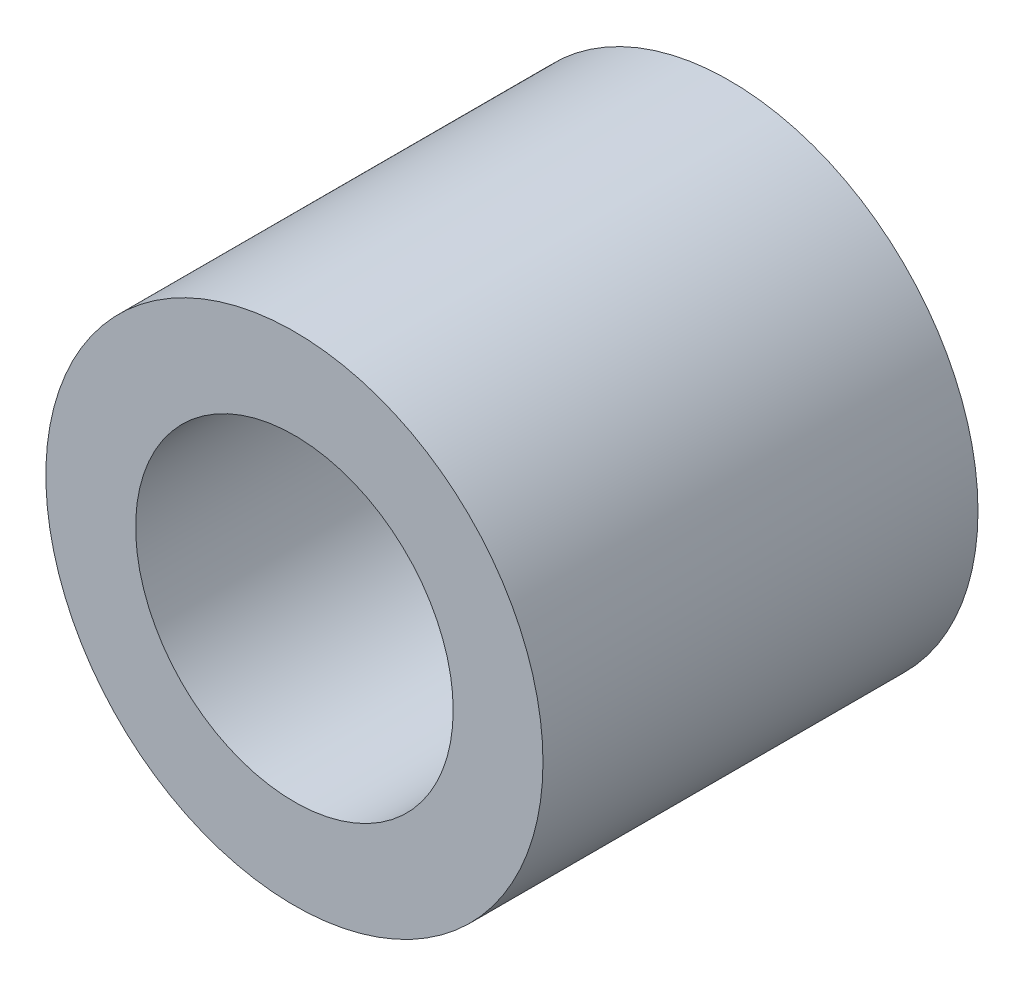
ISO-10303-21;
HEADER;
FILE_DESCRIPTION(('STEP AP214'),'2;1');
FILE_NAME('part.step','',(''),(''),'','','');
FILE_SCHEMA(('AUTOMOTIVE_DESIGN { 1 0 10303 214 1 1 1 1 }'));
ENDSEC;
DATA;
#1=APPLICATION_CONTEXT('core data for automotive mechanical design processes');
#2=APPLICATION_PROTOCOL_DEFINITION('international standard','automotive_design',2000,#1);
#3=PRODUCT_CONTEXT('',#1,'mechanical');
#4=PRODUCT('Part','Part','',(#3));
#5=PRODUCT_RELATED_PRODUCT_CATEGORY('part','',(#4));
#6=PRODUCT_DEFINITION_FORMATION('','',#4);
#7=PRODUCT_DEFINITION_CONTEXT('part definition',#1,'design');
#8=PRODUCT_DEFINITION('design','',#6,#7);
#9=PRODUCT_DEFINITION_SHAPE('','',#8);
#10=(LENGTH_UNIT() NAMED_UNIT(*) SI_UNIT(.MILLI.,.METRE.));
#11=(NAMED_UNIT(*) PLANE_ANGLE_UNIT() SI_UNIT($,.RADIAN.));
#12=(NAMED_UNIT(*) SI_UNIT($,.STERADIAN.) SOLID_ANGLE_UNIT());
#13=UNCERTAINTY_MEASURE_WITH_UNIT(LENGTH_MEASURE(1.E-05),#10,'distance_accuracy_value','');
#14=(GEOMETRIC_REPRESENTATION_CONTEXT(3) GLOBAL_UNCERTAINTY_ASSIGNED_CONTEXT((#13)) GLOBAL_UNIT_ASSIGNED_CONTEXT((#10,
#11,#12)) REPRESENTATION_CONTEXT('',''));
#15=CARTESIAN_POINT('',(0.,0.,0.));
#16=DIRECTION('',(0.,0.,1.));
#17=DIRECTION('',(1.,0.,0.));
#18=AXIS2_PLACEMENT_3D('',#15,#16,#17);
#19=CARTESIAN_POINT('',(0.,0.,7.));
#20=DIRECTION('',(0.,0.,1.));
#21=DIRECTION('',(1.,0.,0.));
#22=AXIS2_PLACEMENT_3D('',#19,#20,#21);
#23=PLANE('',#22);
#24=CARTESIAN_POINT('',(0.,0.,7.));
#25=DIRECTION('',(0.,0.,1.));
#26=DIRECTION('',(1.,0.,0.));
#27=AXIS2_PLACEMENT_3D('',#24,#25,#26);
#28=CIRCLE('',#27,4.);
#29=CARTESIAN_POINT('',(4.,0.,7.));
#30=VERTEX_POINT('',#29);
#31=EDGE_CURVE('E10',#30,#30,#28,.T.);
#32=ORIENTED_EDGE('',*,*,#31,.T.);
#33=EDGE_LOOP('',(#32));
#34=FACE_BOUND('',#33,.T.);
#35=CARTESIAN_POINT('',(0.,0.,7.));
#36=DIRECTION('',(0.,0.,1.));
#37=DIRECTION('',(1.,0.,0.));
#38=AXIS2_PLACEMENT_3D('',#35,#36,#37);
#39=CIRCLE('',#38,2.555);
#40=CARTESIAN_POINT('',(2.555,0.,7.));
#41=VERTEX_POINT('',#40);
#42=EDGE_CURVE('E54',#41,#41,#39,.T.);
#43=ORIENTED_EDGE('',*,*,#42,.F.);
#44=EDGE_LOOP('',(#43));
#45=FACE_BOUND('',#44,.T.);
#46=ADVANCED_FACE('F40',(#34,#45),#23,.T.);
#47=CARTESIAN_POINT('',(0.,0.,0.));
#48=DIRECTION('',(0.,0.,1.));
#49=DIRECTION('',(1.,0.,0.));
#50=AXIS2_PLACEMENT_3D('',#47,#48,#49);
#51=PLANE('',#50);
#52=CARTESIAN_POINT('',(0.,0.,0.));
#53=DIRECTION('',(0.,0.,1.));
#54=DIRECTION('',(1.,0.,0.));
#55=AXIS2_PLACEMENT_3D('',#52,#53,#54);
#56=CIRCLE('',#55,4.);
#57=CARTESIAN_POINT('',(4.,0.,0.));
#58=VERTEX_POINT('',#57);
#59=EDGE_CURVE('E44',#58,#58,#56,.T.);
#60=ORIENTED_EDGE('',*,*,#59,.F.);
#61=EDGE_LOOP('',(#60));
#62=FACE_BOUND('',#61,.T.);
#63=CARTESIAN_POINT('',(0.,0.,0.));
#64=DIRECTION('',(0.,0.,1.));
#65=DIRECTION('',(1.,0.,0.));
#66=AXIS2_PLACEMENT_3D('',#63,#64,#65);
#67=CIRCLE('',#66,2.555);
#68=CARTESIAN_POINT('',(2.555,0.,0.));
#69=VERTEX_POINT('',#68);
#70=EDGE_CURVE('E56',#69,#69,#67,.T.);
#71=ORIENTED_EDGE('',*,*,#70,.T.);
#72=EDGE_LOOP('',(#71));
#73=FACE_BOUND('',#72,.T.);
#74=ADVANCED_FACE('F67',(#62,#73),#51,.F.);
#75=CARTESIAN_POINT('',(0.,0.,7.));
#76=DIRECTION('',(0.,0.,-1.));
#77=DIRECTION('',(-1.,0.,0.));
#78=AXIS2_PLACEMENT_3D('',#75,#76,#77);
#79=CYLINDRICAL_SURFACE('',#78,4.);
#80=ORIENTED_EDGE('',*,*,#31,.F.);
#81=EDGE_LOOP('',(#80));
#82=FACE_BOUND('',#81,.T.);
#83=ORIENTED_EDGE('',*,*,#59,.T.);
#84=EDGE_LOOP('',(#83));
#85=FACE_BOUND('',#84,.T.);
#86=ADVANCED_FACE('F42',(#82,#85),#79,.T.);
#87=CARTESIAN_POINT('',(0.,0.,7.));
#88=DIRECTION('',(0.,0.,-1.));
#89=DIRECTION('',(-1.,0.,0.));
#90=AXIS2_PLACEMENT_3D('',#87,#88,#89);
#91=CYLINDRICAL_SURFACE('',#90,2.555);
#92=ORIENTED_EDGE('',*,*,#42,.T.);
#93=EDGE_LOOP('',(#92));
#94=FACE_BOUND('',#93,.T.);
#95=ORIENTED_EDGE('',*,*,#70,.F.);
#96=EDGE_LOOP('',(#95));
#97=FACE_BOUND('',#96,.T.);
#98=ADVANCED_FACE('F63',(#94,#97),#91,.F.);
#99=CLOSED_SHELL('',(#46,#74,#86,#98));
#100=MANIFOLD_SOLID_BREP('B2',#99);
#101=ADVANCED_BREP_SHAPE_REPRESENTATION('',(#18,#100),#14);
#102=SHAPE_DEFINITION_REPRESENTATION(#9,#101);
ENDSEC;
END-ISO-10303-21;
